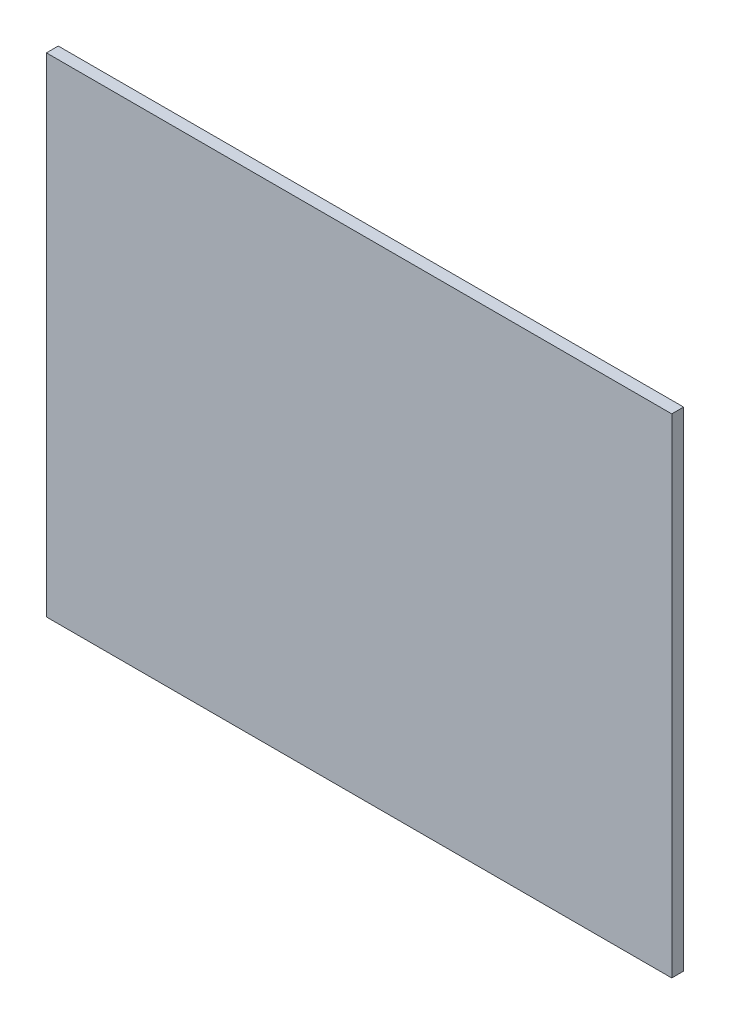
ISO-10303-21;
HEADER;
FILE_DESCRIPTION(('STEP AP214'),'2;1');
FILE_NAME('part.step','',(''),(''),'','','');
FILE_SCHEMA(('AUTOMOTIVE_DESIGN { 1 0 10303 214 1 1 1 1 }'));
ENDSEC;
DATA;
#1=APPLICATION_CONTEXT('core data for automotive mechanical design processes');
#2=APPLICATION_PROTOCOL_DEFINITION('international standard','automotive_design',2000,#1);
#3=PRODUCT_CONTEXT('',#1,'mechanical');
#4=PRODUCT('Part','Part','',(#3));
#5=PRODUCT_RELATED_PRODUCT_CATEGORY('part','',(#4));
#6=PRODUCT_DEFINITION_FORMATION('','',#4);
#7=PRODUCT_DEFINITION_CONTEXT('part definition',#1,'design');
#8=PRODUCT_DEFINITION('design','',#6,#7);
#9=PRODUCT_DEFINITION_SHAPE('','',#8);
#10=(LENGTH_UNIT() NAMED_UNIT(*) SI_UNIT(.MILLI.,.METRE.));
#11=(NAMED_UNIT(*) PLANE_ANGLE_UNIT() SI_UNIT($,.RADIAN.));
#12=(NAMED_UNIT(*) SI_UNIT($,.STERADIAN.) SOLID_ANGLE_UNIT());
#13=UNCERTAINTY_MEASURE_WITH_UNIT(LENGTH_MEASURE(1.E-05),#10,'distance_accuracy_value','');
#14=(GEOMETRIC_REPRESENTATION_CONTEXT(3) GLOBAL_UNCERTAINTY_ASSIGNED_CONTEXT((#13)) GLOBAL_UNIT_ASSIGNED_CONTEXT((#10,
#11,#12)) REPRESENTATION_CONTEXT('',''));
#15=CARTESIAN_POINT('',(0.,0.,0.));
#16=DIRECTION('',(0.,0.,1.));
#17=DIRECTION('',(1.,0.,0.));
#18=AXIS2_PLACEMENT_3D('',#15,#16,#17);
#19=CARTESIAN_POINT('',(812.8,-317.5,-7.69187257701813));
#20=DIRECTION('',(0.,0.,1.));
#21=DIRECTION('',(1.,0.,0.));
#22=AXIS2_PLACEMENT_3D('',#19,#20,#21);
#23=PLANE('',#22);
#24=DIRECTION('',(0.,1.,0.));
#25=VECTOR('',#24,1.);
#26=CARTESIAN_POINT('',(0.,-317.5,-7.69187257701813));
#27=LINE('',#26,#25);
#28=CARTESIAN_POINT('',(0.,-317.5,-7.69187257701813));
#29=VERTEX_POINT('',#28);
#30=CARTESIAN_POINT('',(0.,317.5,-7.69187257701813));
#31=VERTEX_POINT('',#30);
#32=EDGE_CURVE('E96',#29,#31,#27,.T.);
#33=ORIENTED_EDGE('',*,*,#32,.T.);
#34=DIRECTION('',(-1.,0.,0.));
#35=VECTOR('',#34,1.);
#36=CARTESIAN_POINT('',(812.8,317.5,-7.69187257701813));
#37=LINE('',#36,#35);
#38=CARTESIAN_POINT('',(812.8,317.5,-7.69187257701813));
#39=VERTEX_POINT('',#38);
#40=EDGE_CURVE('E11',#39,#31,#37,.T.);
#41=ORIENTED_EDGE('',*,*,#40,.F.);
#42=DIRECTION('',(0.,1.,0.));
#43=VECTOR('',#42,1.);
#44=CARTESIAN_POINT('',(812.8,-317.5,-7.69187257701813));
#45=LINE('',#44,#43);
#46=CARTESIAN_POINT('',(812.8,-317.5,-7.69187257701813));
#47=VERTEX_POINT('',#46);
#48=EDGE_CURVE('E84',#47,#39,#45,.T.);
#49=ORIENTED_EDGE('',*,*,#48,.F.);
#50=DIRECTION('',(-1.,0.,0.));
#51=VECTOR('',#50,1.);
#52=CARTESIAN_POINT('',(812.8,-317.5,-7.69187257701813));
#53=LINE('',#52,#51);
#54=EDGE_CURVE('E92',#47,#29,#53,.T.);
#55=ORIENTED_EDGE('',*,*,#54,.T.);
#56=EDGE_LOOP('',(#33,#41,#49,#55));
#57=FACE_BOUND('',#56,.T.);
#58=ADVANCED_FACE('F33',(#57),#23,.F.);
#59=CARTESIAN_POINT('',(812.8,317.5,7.69187257701813));
#60=DIRECTION('',(0.,-1.,0.));
#61=DIRECTION('',(0.,0.,-1.));
#62=AXIS2_PLACEMENT_3D('',#59,#60,#61);
#63=PLANE('',#62);
#64=DIRECTION('',(0.,0.,1.));
#65=VECTOR('',#64,1.);
#66=CARTESIAN_POINT('',(0.,317.5,7.69187257701813));
#67=LINE('',#66,#65);
#68=CARTESIAN_POINT('',(0.,317.5,7.69187257701813));
#69=VERTEX_POINT('',#68);
#70=EDGE_CURVE('E88',#31,#69,#67,.T.);
#71=ORIENTED_EDGE('',*,*,#70,.T.);
#72=DIRECTION('',(-1.,0.,0.));
#73=VECTOR('',#72,1.);
#74=CARTESIAN_POINT('',(812.8,317.5,7.69187257701813));
#75=LINE('',#74,#73);
#76=CARTESIAN_POINT('',(812.8,317.5,7.69187257701813));
#77=VERTEX_POINT('',#76);
#78=EDGE_CURVE('E41',#77,#69,#75,.T.);
#79=ORIENTED_EDGE('',*,*,#78,.F.);
#80=DIRECTION('',(0.,0.,1.));
#81=VECTOR('',#80,1.);
#82=CARTESIAN_POINT('',(812.8,317.5,7.69187257701813));
#83=LINE('',#82,#81);
#84=EDGE_CURVE('E79',#39,#77,#83,.T.);
#85=ORIENTED_EDGE('',*,*,#84,.F.);
#86=ORIENTED_EDGE('',*,*,#40,.T.);
#87=EDGE_LOOP('',(#71,#79,#85,#86));
#88=FACE_BOUND('',#87,.T.);
#89=ADVANCED_FACE('F87',(#88),#63,.F.);
#90=CARTESIAN_POINT('',(812.8,-317.5,7.69187257701813));
#91=DIRECTION('',(0.,0.,-1.));
#92=DIRECTION('',(-1.,0.,0.));
#93=AXIS2_PLACEMENT_3D('',#90,#91,#92);
#94=PLANE('',#93);
#95=DIRECTION('',(0.,-1.,0.));
#96=VECTOR('',#95,1.);
#97=CARTESIAN_POINT('',(0.,-317.5,7.69187257701813));
#98=LINE('',#97,#96);
#99=CARTESIAN_POINT('',(0.,-317.5,7.69187257701813));
#100=VERTEX_POINT('',#99);
#101=EDGE_CURVE('E66',#69,#100,#98,.T.);
#102=ORIENTED_EDGE('',*,*,#101,.T.);
#103=DIRECTION('',(-1.,0.,0.));
#104=VECTOR('',#103,1.);
#105=CARTESIAN_POINT('',(812.8,-317.5,7.69187257701813));
#106=LINE('',#105,#104);
#107=CARTESIAN_POINT('',(812.8,-317.5,7.69187257701813));
#108=VERTEX_POINT('',#107);
#109=EDGE_CURVE('E89',#108,#100,#106,.T.);
#110=ORIENTED_EDGE('',*,*,#109,.F.);
#111=DIRECTION('',(0.,-1.,0.));
#112=VECTOR('',#111,1.);
#113=CARTESIAN_POINT('',(812.8,-317.5,7.69187257701813));
#114=LINE('',#113,#112);
#115=EDGE_CURVE('E82',#77,#108,#114,.T.);
#116=ORIENTED_EDGE('',*,*,#115,.F.);
#117=ORIENTED_EDGE('',*,*,#78,.T.);
#118=EDGE_LOOP('',(#102,#110,#116,#117));
#119=FACE_BOUND('',#118,.T.);
#120=ADVANCED_FACE('F90',(#119),#94,.F.);
#121=CARTESIAN_POINT('',(812.8,-317.5,7.69187257701813));
#122=DIRECTION('',(0.,1.,0.));
#123=DIRECTION('',(0.,0.,1.));
#124=AXIS2_PLACEMENT_3D('',#121,#122,#123);
#125=PLANE('',#124);
#126=DIRECTION('',(0.,0.,-1.));
#127=VECTOR('',#126,1.);
#128=CARTESIAN_POINT('',(0.,-317.5,7.69187257701813));
#129=LINE('',#128,#127);
#130=EDGE_CURVE('E72',#100,#29,#129,.T.);
#131=ORIENTED_EDGE('',*,*,#130,.T.);
#132=ORIENTED_EDGE('',*,*,#54,.F.);
#133=DIRECTION('',(0.,0.,-1.));
#134=VECTOR('',#133,1.);
#135=CARTESIAN_POINT('',(812.8,-317.5,7.69187257701813));
#136=LINE('',#135,#134);
#137=EDGE_CURVE('E49',#108,#47,#136,.T.);
#138=ORIENTED_EDGE('',*,*,#137,.F.);
#139=ORIENTED_EDGE('',*,*,#109,.T.);
#140=EDGE_LOOP('',(#131,#132,#138,#139));
#141=FACE_BOUND('',#140,.T.);
#142=ADVANCED_FACE('F103',(#141),#125,.F.);
#143=CARTESIAN_POINT('',(812.8,0.,0.));
#144=DIRECTION('',(-1.,0.,0.));
#145=DIRECTION('',(0.,0.,1.));
#146=AXIS2_PLACEMENT_3D('',#143,#144,#145);
#147=PLANE('',#146);
#148=ORIENTED_EDGE('',*,*,#48,.T.);
#149=ORIENTED_EDGE('',*,*,#84,.T.);
#150=ORIENTED_EDGE('',*,*,#115,.T.);
#151=ORIENTED_EDGE('',*,*,#137,.T.);
#152=EDGE_LOOP('',(#148,#149,#150,#151));
#153=FACE_BOUND('',#152,.T.);
#154=ADVANCED_FACE('F80',(#153),#147,.F.);
#155=CARTESIAN_POINT('',(0.,0.,0.));
#156=DIRECTION('',(-1.,0.,0.));
#157=DIRECTION('',(0.,0.,1.));
#158=AXIS2_PLACEMENT_3D('',#155,#156,#157);
#159=PLANE('',#158);
#160=ORIENTED_EDGE('',*,*,#32,.F.);
#161=ORIENTED_EDGE('',*,*,#130,.F.);
#162=ORIENTED_EDGE('',*,*,#101,.F.);
#163=ORIENTED_EDGE('',*,*,#70,.F.);
#164=EDGE_LOOP('',(#160,#161,#162,#163));
#165=FACE_BOUND('',#164,.T.);
#166=ADVANCED_FACE('F106',(#165),#159,.T.);
#167=CLOSED_SHELL('',(#58,#89,#120,#142,#154,#166));
#168=MANIFOLD_SOLID_BREP('B2',#167);
#169=ADVANCED_BREP_SHAPE_REPRESENTATION('',(#18,#168),#14);
#170=SHAPE_DEFINITION_REPRESENTATION(#9,#169);
ENDSEC;
END-ISO-10303-21;
